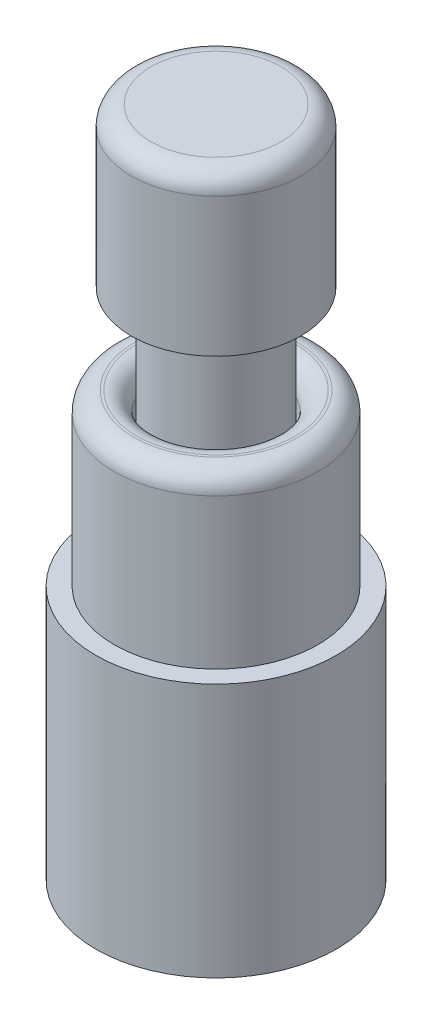
ISO-10303-21;
HEADER;
FILE_DESCRIPTION(('STEP AP214'),'2;1');
FILE_NAME('part.step','',(''),(''),'','','');
FILE_SCHEMA(('AUTOMOTIVE_DESIGN { 1 0 10303 214 1 1 1 1 }'));
ENDSEC;
DATA;
#1=APPLICATION_CONTEXT('core data for automotive mechanical design processes');
#2=APPLICATION_PROTOCOL_DEFINITION('international standard','automotive_design',2000,#1);
#3=PRODUCT_CONTEXT('',#1,'mechanical');
#4=PRODUCT('Part','Part','',(#3));
#5=PRODUCT_RELATED_PRODUCT_CATEGORY('part','',(#4));
#6=PRODUCT_DEFINITION_FORMATION('','',#4);
#7=PRODUCT_DEFINITION_CONTEXT('part definition',#1,'design');
#8=PRODUCT_DEFINITION('design','',#6,#7);
#9=PRODUCT_DEFINITION_SHAPE('','',#8);
#10=(LENGTH_UNIT() NAMED_UNIT(*) SI_UNIT(.MILLI.,.METRE.));
#11=(NAMED_UNIT(*) PLANE_ANGLE_UNIT() SI_UNIT($,.RADIAN.));
#12=(NAMED_UNIT(*) SI_UNIT($,.STERADIAN.) SOLID_ANGLE_UNIT());
#13=UNCERTAINTY_MEASURE_WITH_UNIT(LENGTH_MEASURE(1.E-05),#10,'distance_accuracy_value','');
#14=(GEOMETRIC_REPRESENTATION_CONTEXT(3) GLOBAL_UNCERTAINTY_ASSIGNED_CONTEXT((#13)) GLOBAL_UNIT_ASSIGNED_CONTEXT((#10,
#11,#12)) REPRESENTATION_CONTEXT('',''));
#15=CARTESIAN_POINT('',(0.,0.,0.));
#16=DIRECTION('',(0.,0.,1.));
#17=DIRECTION('',(1.,0.,0.));
#18=AXIS2_PLACEMENT_3D('',#15,#16,#17);
#19=CARTESIAN_POINT('',(0.,0.4,0.));
#20=DIRECTION('',(0.,1.,0.));
#21=DIRECTION('',(0.,0.,1.));
#22=AXIS2_PLACEMENT_3D('',#19,#20,#21);
#23=PLANE('',#22);
#24=CARTESIAN_POINT('',(0.,0.4,0.));
#25=DIRECTION('',(0.,1.,0.));
#26=DIRECTION('',(0.,0.,1.));
#27=AXIS2_PLACEMENT_3D('',#24,#25,#26);
#28=CIRCLE('',#27,2.1082);
#29=CARTESIAN_POINT('',(0.,0.4,2.1082));
#30=VERTEX_POINT('',#29);
#31=EDGE_CURVE('E63',#30,#30,#28,.T.);
#32=ORIENTED_EDGE('',*,*,#31,.T.);
#33=EDGE_LOOP('',(#32));
#34=FACE_BOUND('',#33,.T.);
#35=CARTESIAN_POINT('',(0.,0.399999999999999,0.));
#36=DIRECTION('',(0.,1.,0.));
#37=DIRECTION('',(0.,0.,1.));
#38=AXIS2_PLACEMENT_3D('',#35,#36,#37);
#39=CIRCLE('',#38,2.000000064);
#40=CARTESIAN_POINT('',(0.,0.399999999999999,2.000000064));
#41=VERTEX_POINT('',#40);
#42=EDGE_CURVE('E60',#41,#41,#39,.F.);
#43=ORIENTED_EDGE('',*,*,#42,.T.);
#44=EDGE_LOOP('',(#43));
#45=FACE_BOUND('',#44,.T.);
#46=ADVANCED_FACE('F33',(#34,#45),#23,.T.);
#47=CARTESIAN_POINT('',(0.,6.,0.));
#48=DIRECTION('',(0.,-1.,0.));
#49=DIRECTION('',(0.,0.,-1.));
#50=AXIS2_PLACEMENT_3D('',#47,#48,#49);
#51=CYLINDRICAL_SURFACE('',#50,3.6);
#52=CARTESIAN_POINT('',(0.,5.3,0.));
#53=DIRECTION('',(0.,1.,0.));
#54=DIRECTION('',(0.,0.,1.));
#55=AXIS2_PLACEMENT_3D('',#52,#53,#54);
#56=CIRCLE('',#55,3.6);
#57=CARTESIAN_POINT('',(0.,5.3,3.6));
#58=VERTEX_POINT('',#57);
#59=EDGE_CURVE('E48',#58,#58,#56,.F.);
#60=ORIENTED_EDGE('',*,*,#59,.T.);
#61=EDGE_LOOP('',(#60));
#62=FACE_BOUND('',#61,.T.);
#63=CARTESIAN_POINT('',(0.,0.,0.));
#64=DIRECTION('',(0.,1.,0.));
#65=DIRECTION('',(0.,0.,1.));
#66=AXIS2_PLACEMENT_3D('',#63,#64,#65);
#67=CIRCLE('',#66,3.6);
#68=CARTESIAN_POINT('',(0.,0.,3.6));
#69=VERTEX_POINT('',#68);
#70=EDGE_CURVE('E59',#69,#69,#67,.T.);
#71=ORIENTED_EDGE('',*,*,#70,.T.);
#72=EDGE_LOOP('',(#71));
#73=FACE_BOUND('',#72,.T.);
#74=ADVANCED_FACE('F109',(#62,#73),#51,.T.);
#75=CARTESIAN_POINT('',(0.,6.,0.));
#76=DIRECTION('',(0.,1.,0.));
#77=DIRECTION('',(0.,0.,1.));
#78=AXIS2_PLACEMENT_3D('',#75,#76,#77);
#79=PLANE('',#78);
#80=CARTESIAN_POINT('',(0.,6.,0.));
#81=DIRECTION('',(0.,1.,0.));
#82=DIRECTION('',(0.,0.,1.));
#83=AXIS2_PLACEMENT_3D('',#80,#81,#82);
#84=CIRCLE('',#83,2.9);
#85=CARTESIAN_POINT('',(0.,6.,2.9));
#86=VERTEX_POINT('',#85);
#87=EDGE_CURVE('E53',#86,#86,#84,.T.);
#88=ORIENTED_EDGE('',*,*,#87,.T.);
#89=EDGE_LOOP('',(#88));
#90=FACE_BOUND('',#89,.T.);
#91=CARTESIAN_POINT('',(0.,6.,0.));
#92=DIRECTION('',(0.,1.,0.));
#93=DIRECTION('',(0.,0.,1.));
#94=AXIS2_PLACEMENT_3D('',#91,#92,#93);
#95=CIRCLE('',#94,2.8082);
#96=CARTESIAN_POINT('',(0.,6.,2.8082));
#97=VERTEX_POINT('',#96);
#98=EDGE_CURVE('E56',#97,#97,#95,.F.);
#99=ORIENTED_EDGE('',*,*,#98,.T.);
#100=EDGE_LOOP('',(#99));
#101=FACE_BOUND('',#100,.T.);
#102=ADVANCED_FACE('F114',(#90,#101),#79,.T.);
#103=CARTESIAN_POINT('',(0.,0.,0.));
#104=DIRECTION('',(0.,1.,0.));
#105=DIRECTION('',(0.,0.,1.));
#106=AXIS2_PLACEMENT_3D('',#103,#104,#105);
#107=PLANE('',#106);
#108=CARTESIAN_POINT('',(0.,0.,0.));
#109=DIRECTION('',(0.,1.,0.));
#110=DIRECTION('',(0.,0.,1.));
#111=AXIS2_PLACEMENT_3D('',#108,#109,#110);
#112=CIRCLE('',#111,4.250000009);
#113=CARTESIAN_POINT('',(0.,0.,4.250000009));
#114=VERTEX_POINT('',#113);
#115=EDGE_CURVE('E68',#114,#114,#112,.T.);
#116=ORIENTED_EDGE('',*,*,#115,.T.);
#117=EDGE_LOOP('',(#116));
#118=FACE_BOUND('',#117,.T.);
#119=ORIENTED_EDGE('',*,*,#70,.F.);
#120=EDGE_LOOP('',(#119));
#121=FACE_BOUND('',#120,.T.);
#122=ADVANCED_FACE('F123',(#118,#121),#107,.T.);
#123=CARTESIAN_POINT('',(0.,-9.,0.));
#124=DIRECTION('',(0.,1.,0.));
#125=DIRECTION('',(0.,0.,1.));
#126=AXIS2_PLACEMENT_3D('',#123,#124,#125);
#127=CYLINDRICAL_SURFACE('',#126,4.250000009);
#128=CARTESIAN_POINT('',(0.,-9.,0.));
#129=DIRECTION('',(0.,1.,0.));
#130=DIRECTION('',(0.,0.,1.));
#131=AXIS2_PLACEMENT_3D('',#128,#129,#130);
#132=CIRCLE('',#131,4.250000009);
#133=CARTESIAN_POINT('',(0.,-9.,4.250000009));
#134=VERTEX_POINT('',#133);
#135=EDGE_CURVE('E67',#134,#134,#132,.T.);
#136=ORIENTED_EDGE('',*,*,#135,.T.);
#137=EDGE_LOOP('',(#136));
#138=FACE_BOUND('',#137,.T.);
#139=ORIENTED_EDGE('',*,*,#115,.F.);
#140=EDGE_LOOP('',(#139));
#141=FACE_BOUND('',#140,.T.);
#142=ADVANCED_FACE('F121',(#138,#141),#127,.T.);
#143=CARTESIAN_POINT('',(0.,-9.,0.));
#144=DIRECTION('',(0.,1.,0.));
#145=DIRECTION('',(0.,0.,1.));
#146=AXIS2_PLACEMENT_3D('',#143,#144,#145);
#147=PLANE('',#146);
#148=ORIENTED_EDGE('',*,*,#135,.F.);
#149=EDGE_LOOP('',(#148));
#150=FACE_BOUND('',#149,.T.);
#151=ADVANCED_FACE('F102',(#150),#147,.F.);
#152=CARTESIAN_POINT('',(0.,0.4,0.));
#153=DIRECTION('',(0.,1.,0.));
#154=DIRECTION('',(0.,0.,1.));
#155=AXIS2_PLACEMENT_3D('',#152,#153,#154);
#156=CYLINDRICAL_SURFACE('',#155,2.1082);
#157=CARTESIAN_POINT('',(0.,5.3,0.));
#158=DIRECTION('',(0.,1.,0.));
#159=DIRECTION('',(0.,0.,1.));
#160=AXIS2_PLACEMENT_3D('',#157,#158,#159);
#161=CIRCLE('',#160,2.1082);
#162=CARTESIAN_POINT('',(0.,5.3,2.1082));
#163=VERTEX_POINT('',#162);
#164=EDGE_CURVE('E44',#163,#163,#161,.T.);
#165=ORIENTED_EDGE('',*,*,#164,.T.);
#166=EDGE_LOOP('',(#165));
#167=FACE_BOUND('',#166,.T.);
#168=ORIENTED_EDGE('',*,*,#31,.F.);
#169=EDGE_LOOP('',(#168));
#170=FACE_BOUND('',#169,.T.);
#171=ADVANCED_FACE('F93',(#167,#170),#156,.F.);
#172=CARTESIAN_POINT('',(0.,9.156,0.));
#173=DIRECTION('',(0.,-1.,0.));
#174=DIRECTION('',(0.,0.,-1.));
#175=AXIS2_PLACEMENT_3D('',#172,#173,#174);
#176=CYLINDRICAL_SURFACE('',#175,2.000000064);
#177=ORIENTED_EDGE('',*,*,#42,.F.);
#178=EDGE_LOOP('',(#177));
#179=FACE_BOUND('',#178,.T.);
#180=CARTESIAN_POINT('',(0.,9.156,0.));
#181=DIRECTION('',(0.,1.,0.));
#182=DIRECTION('',(0.,0.,1.));
#183=AXIS2_PLACEMENT_3D('',#180,#181,#182);
#184=CIRCLE('',#183,2.000000064);
#185=CARTESIAN_POINT('',(0.,9.156,2.000000064));
#186=VERTEX_POINT('',#185);
#187=EDGE_CURVE('E64',#186,#186,#184,.T.);
#188=ORIENTED_EDGE('',*,*,#187,.F.);
#189=EDGE_LOOP('',(#188));
#190=FACE_BOUND('',#189,.T.);
#191=ADVANCED_FACE('F90',(#179,#190),#176,.T.);
#192=CARTESIAN_POINT('',(0.,5.3,0.));
#193=DIRECTION('',(0.,1.,0.));
#194=DIRECTION('',(0.,0.,1.));
#195=AXIS2_PLACEMENT_3D('',#192,#193,#194);
#196=TOROIDAL_SURFACE('',#195,2.9,0.7);
#197=ORIENTED_EDGE('',*,*,#59,.F.);
#198=EDGE_LOOP('',(#197));
#199=FACE_BOUND('',#198,.T.);
#200=ORIENTED_EDGE('',*,*,#87,.F.);
#201=EDGE_LOOP('',(#200));
#202=FACE_BOUND('',#201,.T.);
#203=ADVANCED_FACE('F92',(#199,#202),#196,.T.);
#204=CARTESIAN_POINT('',(0.,5.3,0.));
#205=DIRECTION('',(0.,1.,0.));
#206=DIRECTION('',(0.,0.,1.));
#207=AXIS2_PLACEMENT_3D('',#204,#205,#206);
#208=TOROIDAL_SURFACE('',#207,2.8082,0.7);
#209=ORIENTED_EDGE('',*,*,#98,.F.);
#210=EDGE_LOOP('',(#209));
#211=FACE_BOUND('',#210,.T.);
#212=ORIENTED_EDGE('',*,*,#164,.F.);
#213=EDGE_LOOP('',(#212));
#214=FACE_BOUND('',#213,.T.);
#215=ADVANCED_FACE('F86',(#211,#214),#208,.T.);
#216=CARTESIAN_POINT('',(0.,9.156,0.));
#217=DIRECTION('',(0.,1.,0.));
#218=DIRECTION('',(0.,0.,1.));
#219=AXIS2_PLACEMENT_3D('',#216,#217,#218);
#220=PLANE('',#219);
#221=CARTESIAN_POINT('',(0.,9.156,0.));
#222=DIRECTION('',(0.,1.,0.));
#223=DIRECTION('',(0.,0.,1.));
#224=AXIS2_PLACEMENT_3D('',#221,#222,#223);
#225=CIRCLE('',#224,3.000000096);
#226=CARTESIAN_POINT('',(0.,9.156,3.000000096));
#227=VERTEX_POINT('',#226);
#228=EDGE_CURVE('E77',#227,#227,#225,.T.);
#229=ORIENTED_EDGE('',*,*,#228,.F.);
#230=EDGE_LOOP('',(#229));
#231=FACE_BOUND('',#230,.T.);
#232=ORIENTED_EDGE('',*,*,#187,.T.);
#233=EDGE_LOOP('',(#232));
#234=FACE_BOUND('',#233,.T.);
#235=ADVANCED_FACE('F83',(#231,#234),#220,.F.);
#236=CARTESIAN_POINT('',(0.,14.756,0.));
#237=DIRECTION('',(0.,-1.,0.));
#238=DIRECTION('',(0.,0.,-1.));
#239=AXIS2_PLACEMENT_3D('',#236,#237,#238);
#240=CYLINDRICAL_SURFACE('',#239,3.000000096);
#241=CARTESIAN_POINT('',(0.,14.056,0.));
#242=DIRECTION('',(0.,1.,0.));
#243=DIRECTION('',(0.,0.,1.));
#244=AXIS2_PLACEMENT_3D('',#241,#242,#243);
#245=CIRCLE('',#244,3.000000096);
#246=CARTESIAN_POINT('',(0.,14.056,3.000000096));
#247=VERTEX_POINT('',#246);
#248=EDGE_CURVE('E10',#247,#247,#245,.F.);
#249=ORIENTED_EDGE('',*,*,#248,.T.);
#250=EDGE_LOOP('',(#249));
#251=FACE_BOUND('',#250,.T.);
#252=ORIENTED_EDGE('',*,*,#228,.T.);
#253=EDGE_LOOP('',(#252));
#254=FACE_BOUND('',#253,.T.);
#255=ADVANCED_FACE('F81',(#251,#254),#240,.T.);
#256=CARTESIAN_POINT('',(0.,14.756,0.));
#257=DIRECTION('',(0.,1.,0.));
#258=DIRECTION('',(0.,0.,1.));
#259=AXIS2_PLACEMENT_3D('',#256,#257,#258);
#260=PLANE('',#259);
#261=CARTESIAN_POINT('',(0.,14.756,0.));
#262=DIRECTION('',(0.,1.,0.));
#263=DIRECTION('',(0.,0.,1.));
#264=AXIS2_PLACEMENT_3D('',#261,#262,#263);
#265=CIRCLE('',#264,2.300000096);
#266=CARTESIAN_POINT('',(0.,14.756,2.300000096));
#267=VERTEX_POINT('',#266);
#268=EDGE_CURVE('E40',#267,#267,#265,.T.);
#269=ORIENTED_EDGE('',*,*,#268,.T.);
#270=EDGE_LOOP('',(#269));
#271=FACE_BOUND('',#270,.T.);
#272=ADVANCED_FACE('F155',(#271),#260,.T.);
#273=CARTESIAN_POINT('',(0.,14.056,0.));
#274=DIRECTION('',(0.,1.,0.));
#275=DIRECTION('',(0.,0.,1.));
#276=AXIS2_PLACEMENT_3D('',#273,#274,#275);
#277=TOROIDAL_SURFACE('',#276,2.300000096,0.7);
#278=ORIENTED_EDGE('',*,*,#248,.F.);
#279=EDGE_LOOP('',(#278));
#280=FACE_BOUND('',#279,.T.);
#281=ORIENTED_EDGE('',*,*,#268,.F.);
#282=EDGE_LOOP('',(#281));
#283=FACE_BOUND('',#282,.T.);
#284=ADVANCED_FACE('F35',(#280,#283),#277,.T.);
#285=CLOSED_SHELL('',(#46,#74,#102,#122,#142,#151,#171,#191,#203,#215,#235,#255,#272,#284));
#286=MANIFOLD_SOLID_BREP('B2',#285);
#287=ADVANCED_BREP_SHAPE_REPRESENTATION('',(#18,#286),#14);
#288=SHAPE_DEFINITION_REPRESENTATION(#9,#287);
ENDSEC;
END-ISO-10303-21;
